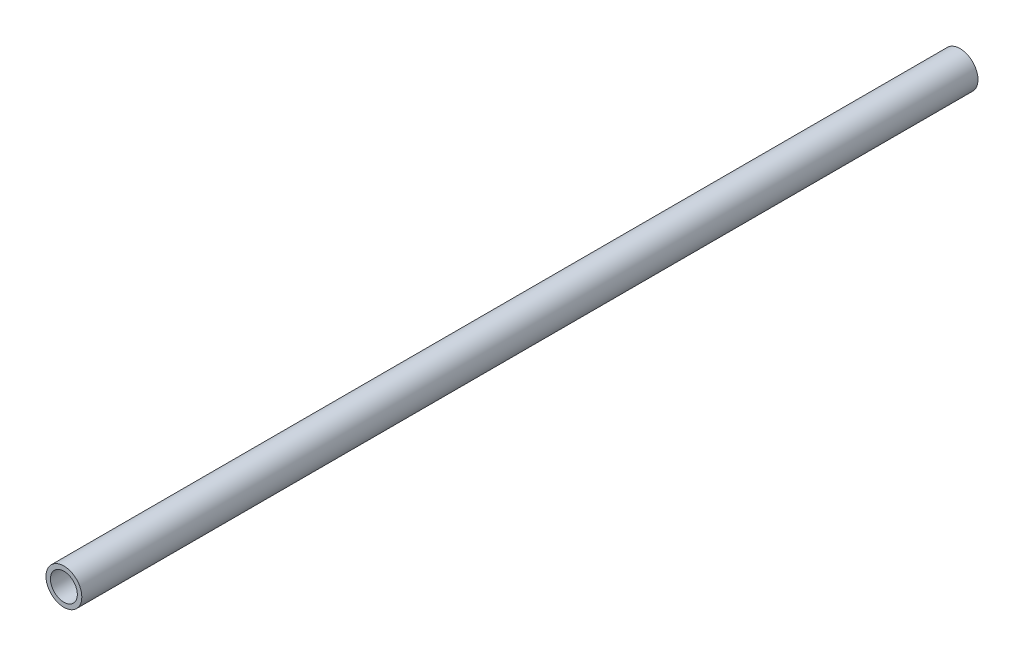
ISO-10303-21;
HEADER;
FILE_DESCRIPTION(('STEP AP214'),'2;1');
FILE_NAME('part.step','',(''),(''),'','','');
FILE_SCHEMA(('AUTOMOTIVE_DESIGN { 1 0 10303 214 1 1 1 1 }'));
ENDSEC;
DATA;
#1=APPLICATION_CONTEXT('core data for automotive mechanical design processes');
#2=APPLICATION_PROTOCOL_DEFINITION('international standard','automotive_design',2000,#1);
#3=PRODUCT_CONTEXT('',#1,'mechanical');
#4=PRODUCT('Part','Part','',(#3));
#5=PRODUCT_RELATED_PRODUCT_CATEGORY('part','',(#4));
#6=PRODUCT_DEFINITION_FORMATION('','',#4);
#7=PRODUCT_DEFINITION_CONTEXT('part definition',#1,'design');
#8=PRODUCT_DEFINITION('design','',#6,#7);
#9=PRODUCT_DEFINITION_SHAPE('','',#8);
#10=(LENGTH_UNIT() NAMED_UNIT(*) SI_UNIT(.MILLI.,.METRE.));
#11=(NAMED_UNIT(*) PLANE_ANGLE_UNIT() SI_UNIT($,.RADIAN.));
#12=(NAMED_UNIT(*) SI_UNIT($,.STERADIAN.) SOLID_ANGLE_UNIT());
#13=UNCERTAINTY_MEASURE_WITH_UNIT(LENGTH_MEASURE(1.E-05),#10,'distance_accuracy_value','');
#14=(GEOMETRIC_REPRESENTATION_CONTEXT(3) GLOBAL_UNCERTAINTY_ASSIGNED_CONTEXT((#13)) GLOBAL_UNIT_ASSIGNED_CONTEXT((#10,
#11,#12)) REPRESENTATION_CONTEXT('',''));
#15=CARTESIAN_POINT('',(0.,0.,0.));
#16=DIRECTION('',(0.,0.,1.));
#17=DIRECTION('',(1.,0.,0.));
#18=AXIS2_PLACEMENT_3D('',#15,#16,#17);
#19=CARTESIAN_POINT('',(0.,0.,125.));
#20=DIRECTION('',(0.,0.,1.));
#21=DIRECTION('',(1.,0.,0.));
#22=AXIS2_PLACEMENT_3D('',#19,#20,#21);
#23=PLANE('',#22);
#24=CARTESIAN_POINT('',(0.,0.,125.));
#25=DIRECTION('',(0.,0.,1.));
#26=DIRECTION('',(1.,0.,0.));
#27=AXIS2_PLACEMENT_3D('',#24,#25,#26);
#28=CIRCLE('',#27,5.);
#29=CARTESIAN_POINT('',(5.,0.,125.));
#30=VERTEX_POINT('',#29);
#31=EDGE_CURVE('E10',#30,#30,#28,.T.);
#32=ORIENTED_EDGE('',*,*,#31,.T.);
#33=EDGE_LOOP('',(#32));
#34=FACE_BOUND('',#33,.T.);
#35=CARTESIAN_POINT('',(0.,0.,125.));
#36=DIRECTION('',(0.,0.,1.));
#37=DIRECTION('',(1.,0.,0.));
#38=AXIS2_PLACEMENT_3D('',#35,#36,#37);
#39=CIRCLE('',#38,3.75);
#40=CARTESIAN_POINT('',(3.75,0.,125.));
#41=VERTEX_POINT('',#40);
#42=EDGE_CURVE('E41',#41,#41,#39,.T.);
#43=ORIENTED_EDGE('',*,*,#42,.F.);
#44=EDGE_LOOP('',(#43));
#45=FACE_BOUND('',#44,.T.);
#46=ADVANCED_FACE('F30',(#34,#45),#23,.T.);
#47=CARTESIAN_POINT('',(0.,0.,-125.));
#48=DIRECTION('',(0.,0.,1.));
#49=DIRECTION('',(1.,0.,0.));
#50=AXIS2_PLACEMENT_3D('',#47,#48,#49);
#51=PLANE('',#50);
#52=CARTESIAN_POINT('',(0.,0.,-125.));
#53=DIRECTION('',(0.,0.,1.));
#54=DIRECTION('',(1.,0.,0.));
#55=AXIS2_PLACEMENT_3D('',#52,#53,#54);
#56=CIRCLE('',#55,5.);
#57=CARTESIAN_POINT('',(5.,0.,-125.));
#58=VERTEX_POINT('',#57);
#59=EDGE_CURVE('E34',#58,#58,#56,.T.);
#60=ORIENTED_EDGE('',*,*,#59,.F.);
#61=EDGE_LOOP('',(#60));
#62=FACE_BOUND('',#61,.T.);
#63=CARTESIAN_POINT('',(0.,0.,-125.));
#64=DIRECTION('',(0.,0.,1.));
#65=DIRECTION('',(1.,0.,0.));
#66=AXIS2_PLACEMENT_3D('',#63,#64,#65);
#67=CIRCLE('',#66,3.75);
#68=CARTESIAN_POINT('',(3.75,0.,-125.));
#69=VERTEX_POINT('',#68);
#70=EDGE_CURVE('E43',#69,#69,#67,.T.);
#71=ORIENTED_EDGE('',*,*,#70,.T.);
#72=EDGE_LOOP('',(#71));
#73=FACE_BOUND('',#72,.T.);
#74=ADVANCED_FACE('F53',(#62,#73),#51,.F.);
#75=CARTESIAN_POINT('',(0.,0.,125.));
#76=DIRECTION('',(0.,0.,-1.));
#77=DIRECTION('',(-1.,0.,0.));
#78=AXIS2_PLACEMENT_3D('',#75,#76,#77);
#79=CYLINDRICAL_SURFACE('',#78,5.);
#80=ORIENTED_EDGE('',*,*,#31,.F.);
#81=EDGE_LOOP('',(#80));
#82=FACE_BOUND('',#81,.T.);
#83=ORIENTED_EDGE('',*,*,#59,.T.);
#84=EDGE_LOOP('',(#83));
#85=FACE_BOUND('',#84,.T.);
#86=ADVANCED_FACE('F32',(#82,#85),#79,.T.);
#87=CARTESIAN_POINT('',(0.,0.,125.));
#88=DIRECTION('',(0.,0.,-1.));
#89=DIRECTION('',(-1.,0.,0.));
#90=AXIS2_PLACEMENT_3D('',#87,#88,#89);
#91=CYLINDRICAL_SURFACE('',#90,3.75);
#92=ORIENTED_EDGE('',*,*,#42,.T.);
#93=EDGE_LOOP('',(#92));
#94=FACE_BOUND('',#93,.T.);
#95=ORIENTED_EDGE('',*,*,#70,.F.);
#96=EDGE_LOOP('',(#95));
#97=FACE_BOUND('',#96,.T.);
#98=ADVANCED_FACE('F49',(#94,#97),#91,.F.);
#99=CLOSED_SHELL('',(#46,#74,#86,#98));
#100=MANIFOLD_SOLID_BREP('B2',#99);
#101=ADVANCED_BREP_SHAPE_REPRESENTATION('',(#18,#100),#14);
#102=SHAPE_DEFINITION_REPRESENTATION(#9,#101);
ENDSEC;
END-ISO-10303-21;
